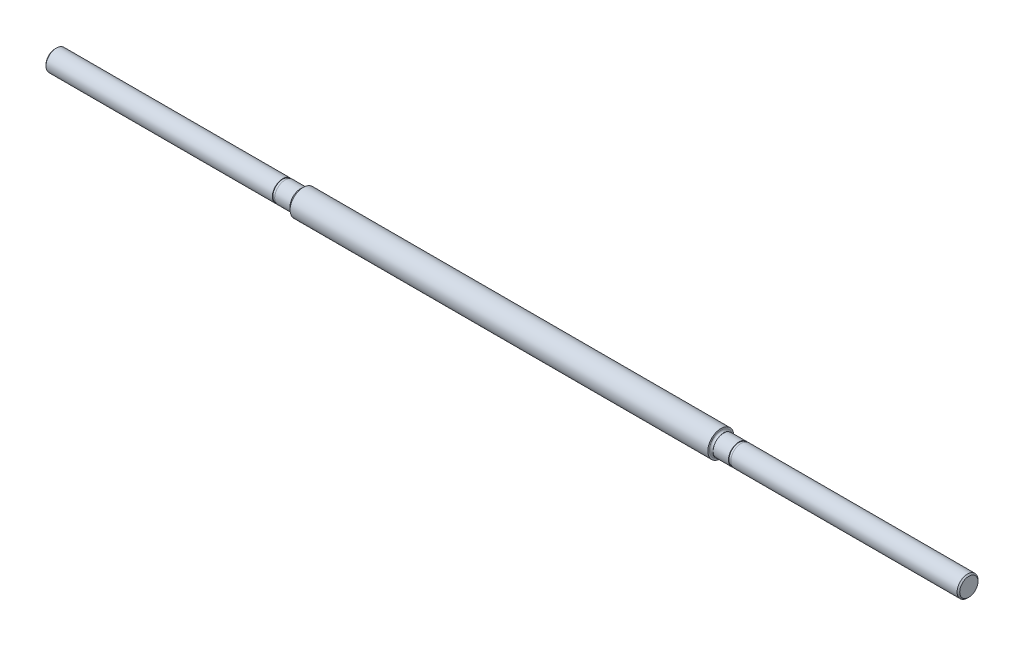
ISO-10303-21;
HEADER;
FILE_DESCRIPTION(('STEP AP214'),'2;1');
FILE_NAME('part.step','',(''),(''),'','','');
FILE_SCHEMA(('AUTOMOTIVE_DESIGN { 1 0 10303 214 1 1 1 1 }'));
ENDSEC;
DATA;
#1=APPLICATION_CONTEXT('core data for automotive mechanical design processes');
#2=APPLICATION_PROTOCOL_DEFINITION('international standard','automotive_design',2000,#1);
#3=PRODUCT_CONTEXT('',#1,'mechanical');
#4=PRODUCT('Part','Part','',(#3));
#5=PRODUCT_RELATED_PRODUCT_CATEGORY('part','',(#4));
#6=PRODUCT_DEFINITION_FORMATION('','',#4);
#7=PRODUCT_DEFINITION_CONTEXT('part definition',#1,'design');
#8=PRODUCT_DEFINITION('design','',#6,#7);
#9=PRODUCT_DEFINITION_SHAPE('','',#8);
#10=(LENGTH_UNIT() NAMED_UNIT(*) SI_UNIT(.MILLI.,.METRE.));
#11=(NAMED_UNIT(*) PLANE_ANGLE_UNIT() SI_UNIT($,.RADIAN.));
#12=(NAMED_UNIT(*) SI_UNIT($,.STERADIAN.) SOLID_ANGLE_UNIT());
#13=UNCERTAINTY_MEASURE_WITH_UNIT(LENGTH_MEASURE(1.E-05),#10,'distance_accuracy_value','');
#14=(GEOMETRIC_REPRESENTATION_CONTEXT(3) GLOBAL_UNCERTAINTY_ASSIGNED_CONTEXT((#13)) GLOBAL_UNIT_ASSIGNED_CONTEXT((#10,
#11,#12)) REPRESENTATION_CONTEXT('',''));
#15=CARTESIAN_POINT('',(0.,0.,0.));
#16=DIRECTION('',(0.,0.,1.));
#17=DIRECTION('',(1.,0.,0.));
#18=AXIS2_PLACEMENT_3D('',#15,#16,#17);
#19=CARTESIAN_POINT('',(95.,4.,0.));
#20=DIRECTION('',(-1.,0.,0.));
#21=DIRECTION('',(0.,0.,1.));
#22=AXIS2_PLACEMENT_3D('',#19,#20,#21);
#23=PLANE('',#22);
#24=CARTESIAN_POINT('',(95.,0.,0.));
#25=DIRECTION('',(1.,0.,0.));
#26=DIRECTION('',(0.,-1.,0.));
#27=AXIS2_PLACEMENT_3D('',#24,#25,#26);
#28=CIRCLE('',#27,4.4);
#29=CARTESIAN_POINT('',(95.,0.,-4.4));
#30=VERTEX_POINT('',#29);
#31=EDGE_CURVE('E110',#30,#30,#28,.T.);
#32=ORIENTED_EDGE('',*,*,#31,.T.);
#33=EDGE_LOOP('',(#32));
#34=FACE_BOUND('',#33,.T.);
#35=CARTESIAN_POINT('',(95.,0.,0.));
#36=DIRECTION('',(-1.,0.,0.));
#37=DIRECTION('',(0.,0.,1.));
#38=AXIS2_PLACEMENT_3D('',#35,#36,#37);
#39=CIRCLE('',#38,5.);
#40=CARTESIAN_POINT('',(95.,-5.,0.));
#41=VERTEX_POINT('',#40);
#42=EDGE_CURVE('E28',#41,#41,#39,.T.);
#43=ORIENTED_EDGE('',*,*,#42,.T.);
#44=EDGE_LOOP('',(#43));
#45=FACE_BOUND('',#44,.T.);
#46=ADVANCED_FACE('F17',(#34,#45),#23,.T.);
#47=CARTESIAN_POINT('',(175.,0.,0.));
#48=DIRECTION('',(-1.,0.,0.));
#49=DIRECTION('',(0.,1.,0.));
#50=AXIS2_PLACEMENT_3D('',#47,#48,#49);
#51=CYLINDRICAL_SURFACE('',#50,5.);
#52=ORIENTED_EDGE('',*,*,#42,.F.);
#53=DIRECTION('',(1.,0.,0.));
#54=VECTOR('',#53,1.);
#55=CARTESIAN_POINT('',(175.,-5.,0.));
#56=LINE('',#55,#54);
#57=CARTESIAN_POINT('',(255.,-5.,0.));
#58=VERTEX_POINT('',#57);
#59=EDGE_CURVE('E11',#41,#58,#56,.T.);
#60=ORIENTED_EDGE('',*,*,#59,.T.);
#61=CARTESIAN_POINT('',(255.,0.,0.));
#62=DIRECTION('',(-1.,0.,0.));
#63=DIRECTION('',(0.,0.,1.));
#64=AXIS2_PLACEMENT_3D('',#61,#62,#63);
#65=CIRCLE('',#64,5.);
#66=EDGE_CURVE('E139',#58,#58,#65,.T.);
#67=ORIENTED_EDGE('',*,*,#66,.T.);
#68=ORIENTED_EDGE('',*,*,#59,.F.);
#69=EDGE_LOOP('',(#52,#60,#67,#68));
#70=FACE_BOUND('',#69,.T.);
#71=ADVANCED_FACE('F286',(#70),#51,.T.);
#72=CARTESIAN_POINT('',(255.,5.,0.));
#73=DIRECTION('',(1.,0.,0.));
#74=DIRECTION('',(0.,1.,0.));
#75=AXIS2_PLACEMENT_3D('',#72,#73,#74);
#76=PLANE('',#75);
#77=CARTESIAN_POINT('',(255.,0.,0.));
#78=DIRECTION('',(-1.,0.,0.));
#79=DIRECTION('',(0.,1.,0.));
#80=AXIS2_PLACEMENT_3D('',#77,#78,#79);
#81=CIRCLE('',#80,4.4);
#82=CARTESIAN_POINT('',(255.,0.,-4.4));
#83=VERTEX_POINT('',#82);
#84=EDGE_CURVE('E195',#83,#83,#81,.T.);
#85=ORIENTED_EDGE('',*,*,#84,.T.);
#86=EDGE_LOOP('',(#85));
#87=FACE_BOUND('',#86,.T.);
#88=ORIENTED_EDGE('',*,*,#66,.F.);
#89=EDGE_LOOP('',(#88));
#90=FACE_BOUND('',#89,.T.);
#91=ADVANCED_FACE('F282',(#87,#90),#76,.T.);
#92=CARTESIAN_POINT('',(0.,0.,0.));
#93=DIRECTION('',(-1.,0.,0.));
#94=DIRECTION('',(0.,0.,1.));
#95=AXIS2_PLACEMENT_3D('',#92,#93,#94);
#96=PLANE('',#95);
#97=CARTESIAN_POINT('',(0.,0.,0.));
#98=DIRECTION('',(1.,0.,0.));
#99=DIRECTION('',(0.,-1.,0.));
#100=AXIS2_PLACEMENT_3D('',#97,#98,#99);
#101=CIRCLE('',#100,3.5);
#102=CARTESIAN_POINT('',(0.,3.5,0.));
#103=VERTEX_POINT('',#102);
#104=EDGE_CURVE('E225',#103,#103,#101,.T.);
#105=ORIENTED_EDGE('',*,*,#104,.F.);
#106=EDGE_LOOP('',(#105));
#107=FACE_BOUND('',#106,.T.);
#108=ADVANCED_FACE('F285',(#107),#96,.T.);
#109=CARTESIAN_POINT('',(22.5,0.,0.));
#110=DIRECTION('',(-1.,0.,0.));
#111=DIRECTION('',(0.,1.,0.));
#112=AXIS2_PLACEMENT_3D('',#109,#110,#111);
#113=CYLINDRICAL_SURFACE('',#112,4.);
#114=CARTESIAN_POINT('',(88.1,0.,0.));
#115=DIRECTION('',(1.,0.,0.));
#116=DIRECTION('',(0.,1.,0.));
#117=AXIS2_PLACEMENT_3D('',#114,#115,#116);
#118=CIRCLE('',#117,4.);
#119=CARTESIAN_POINT('',(88.1,-4.,0.));
#120=VERTEX_POINT('',#119);
#121=EDGE_CURVE('E137',#120,#120,#118,.T.);
#122=ORIENTED_EDGE('',*,*,#121,.T.);
#123=DIRECTION('',(1.,0.,0.));
#124=VECTOR('',#123,1.);
#125=CARTESIAN_POINT('',(22.5,-4.,0.));
#126=LINE('',#125,#124);
#127=CARTESIAN_POINT('',(93.9527864045,-4.,0.));
#128=VERTEX_POINT('',#127);
#129=EDGE_CURVE('E131',#120,#128,#126,.T.);
#130=ORIENTED_EDGE('',*,*,#129,.T.);
#131=CARTESIAN_POINT('',(93.9527864045,0.,0.));
#132=DIRECTION('',(-1.,0.,0.));
#133=DIRECTION('',(0.,1.,0.));
#134=AXIS2_PLACEMENT_3D('',#131,#132,#133);
#135=CIRCLE('',#134,4.);
#136=CARTESIAN_POINT('',(93.9527864045,0.,-4.));
#137=VERTEX_POINT('',#136);
#138=EDGE_CURVE('E135',#128,#137,#135,.T.);
#139=ORIENTED_EDGE('',*,*,#138,.T.);
#140=CARTESIAN_POINT('',(93.9527864045,0.,0.));
#141=DIRECTION('',(-1.,0.,0.));
#142=DIRECTION('',(0.,1.,0.));
#143=AXIS2_PLACEMENT_3D('',#140,#141,#142);
#144=CIRCLE('',#143,4.);
#145=EDGE_CURVE('E141',#137,#128,#144,.T.);
#146=ORIENTED_EDGE('',*,*,#145,.T.);
#147=ORIENTED_EDGE('',*,*,#129,.F.);
#148=EDGE_LOOP('',(#122,#130,#139,#146,#147));
#149=FACE_BOUND('',#148,.T.);
#150=ADVANCED_FACE('F133',(#149),#113,.T.);
#151=CARTESIAN_POINT('',(0.25,0.,0.));
#152=DIRECTION('',(1.,0.,0.));
#153=DIRECTION('',(0.,-1.,0.));
#154=AXIS2_PLACEMENT_3D('',#151,#152,#153);
#155=CONICAL_SURFACE('',#154,3.75,0.78539816339745);
#156=ORIENTED_EDGE('',*,*,#104,.T.);
#157=DIRECTION('',(0.707106781186546,0.707106781186549,0.));
#158=VECTOR('',#157,1.);
#159=CARTESIAN_POINT('',(0.25,3.75,0.));
#160=LINE('',#159,#158);
#161=CARTESIAN_POINT('',(0.5,4.,0.));
#162=VERTEX_POINT('',#161);
#163=EDGE_CURVE('E103',#103,#162,#160,.T.);
#164=ORIENTED_EDGE('',*,*,#163,.T.);
#165=CARTESIAN_POINT('',(0.5,0.,0.));
#166=DIRECTION('',(-1.,0.,0.));
#167=DIRECTION('',(0.,-1.,0.));
#168=AXIS2_PLACEMENT_3D('',#165,#166,#167);
#169=CIRCLE('',#168,4.);
#170=CARTESIAN_POINT('',(0.5,-4.,0.));
#171=VERTEX_POINT('',#170);
#172=EDGE_CURVE('E161',#162,#171,#169,.T.);
#173=ORIENTED_EDGE('',*,*,#172,.T.);
#174=CARTESIAN_POINT('',(0.5,0.,0.));
#175=DIRECTION('',(-1.,0.,0.));
#176=DIRECTION('',(0.,-1.,0.));
#177=AXIS2_PLACEMENT_3D('',#174,#175,#176);
#178=CIRCLE('',#177,4.);
#179=EDGE_CURVE('E155',#171,#162,#178,.T.);
#180=ORIENTED_EDGE('',*,*,#179,.T.);
#181=ORIENTED_EDGE('',*,*,#163,.F.);
#182=EDGE_LOOP('',(#156,#164,#173,#180,#181));
#183=FACE_BOUND('',#182,.T.);
#184=ADVANCED_FACE('F329',(#183),#155,.T.);
#185=CARTESIAN_POINT('',(94.4,0.,0.));
#186=DIRECTION('',(-1.,0.,0.));
#187=DIRECTION('',(0.,0.,1.));
#188=AXIS2_PLACEMENT_3D('',#185,#186,#187);
#189=TOROIDAL_SURFACE('',#188,4.4,0.6);
#190=ORIENTED_EDGE('',*,*,#138,.F.);
#191=ORIENTED_EDGE('',*,*,#145,.F.);
#192=CARTESIAN_POINT('',(94.4,0.,-4.4));
#193=DIRECTION('',(0.,1.,0.));
#194=DIRECTION('',(0.,0.,-1.));
#195=AXIS2_PLACEMENT_3D('',#192,#193,#194);
#196=CIRCLE('',#195,0.6);
#197=EDGE_CURVE('E145',#137,#30,#196,.T.);
#198=ORIENTED_EDGE('',*,*,#197,.T.);
#199=ORIENTED_EDGE('',*,*,#31,.F.);
#200=ORIENTED_EDGE('',*,*,#197,.F.);
#201=EDGE_LOOP('',(#190,#191,#198,#199,#200));
#202=FACE_BOUND('',#201,.T.);
#203=ADVANCED_FACE('F147',(#202),#189,.F.);
#204=CARTESIAN_POINT('',(22.5,0.,0.));
#205=DIRECTION('',(-1.,0.,0.));
#206=DIRECTION('',(0.,1.,0.));
#207=AXIS2_PLACEMENT_3D('',#204,#205,#206);
#208=CYLINDRICAL_SURFACE('',#207,4.);
#209=ORIENTED_EDGE('',*,*,#172,.F.);
#210=ORIENTED_EDGE('',*,*,#179,.F.);
#211=DIRECTION('',(1.,0.,0.));
#212=VECTOR('',#211,1.);
#213=CARTESIAN_POINT('',(22.5,-4.,0.));
#214=LINE('',#213,#212);
#215=CARTESIAN_POINT('',(87.2,-4.,0.));
#216=VERTEX_POINT('',#215);
#217=EDGE_CURVE('E149',#171,#216,#214,.T.);
#218=ORIENTED_EDGE('',*,*,#217,.T.);
#219=CARTESIAN_POINT('',(87.2,0.,0.));
#220=DIRECTION('',(-1.,0.,0.));
#221=DIRECTION('',(0.,1.,0.));
#222=AXIS2_PLACEMENT_3D('',#219,#220,#221);
#223=CIRCLE('',#222,4.);
#224=EDGE_CURVE('E164',#216,#216,#223,.T.);
#225=ORIENTED_EDGE('',*,*,#224,.T.);
#226=ORIENTED_EDGE('',*,*,#217,.F.);
#227=EDGE_LOOP('',(#209,#210,#218,#225,#226));
#228=FACE_BOUND('',#227,.T.);
#229=ADVANCED_FACE('F312',(#228),#208,.T.);
#230=CARTESIAN_POINT('',(87.2,0.,0.));
#231=DIRECTION('',(-1.,0.,0.));
#232=DIRECTION('',(0.,0.,1.));
#233=AXIS2_PLACEMENT_3D('',#230,#231,#232);
#234=PLANE('',#233);
#235=CARTESIAN_POINT('',(87.2,0.,0.));
#236=DIRECTION('',(1.,0.,0.));
#237=DIRECTION('',(0.,-1.,0.));
#238=AXIS2_PLACEMENT_3D('',#235,#236,#237);
#239=CIRCLE('',#238,3.8);
#240=CARTESIAN_POINT('',(87.2,3.8,0.));
#241=VERTEX_POINT('',#240);
#242=EDGE_CURVE('E181',#241,#241,#239,.T.);
#243=ORIENTED_EDGE('',*,*,#242,.F.);
#244=EDGE_LOOP('',(#243));
#245=FACE_BOUND('',#244,.T.);
#246=ORIENTED_EDGE('',*,*,#224,.F.);
#247=EDGE_LOOP('',(#246));
#248=FACE_BOUND('',#247,.T.);
#249=ADVANCED_FACE('F309',(#245,#248),#234,.F.);
#250=CARTESIAN_POINT('',(88.1,0.,0.));
#251=DIRECTION('',(-1.,0.,0.));
#252=DIRECTION('',(0.,0.,1.));
#253=AXIS2_PLACEMENT_3D('',#250,#251,#252);
#254=PLANE('',#253);
#255=CARTESIAN_POINT('',(88.1,0.,0.));
#256=DIRECTION('',(-1.,0.,0.));
#257=DIRECTION('',(0.,-1.,0.));
#258=AXIS2_PLACEMENT_3D('',#255,#256,#257);
#259=CIRCLE('',#258,3.8);
#260=CARTESIAN_POINT('',(88.1,3.8,0.));
#261=VERTEX_POINT('',#260);
#262=EDGE_CURVE('E180',#261,#261,#259,.T.);
#263=ORIENTED_EDGE('',*,*,#262,.F.);
#264=EDGE_LOOP('',(#263));
#265=FACE_BOUND('',#264,.T.);
#266=ORIENTED_EDGE('',*,*,#121,.F.);
#267=EDGE_LOOP('',(#266));
#268=FACE_BOUND('',#267,.T.);
#269=ADVANCED_FACE('F311',(#265,#268),#254,.T.);
#270=CARTESIAN_POINT('',(87.65,0.,0.));
#271=DIRECTION('',(-1.,0.,0.));
#272=DIRECTION('',(0.,-1.,0.));
#273=AXIS2_PLACEMENT_3D('',#270,#271,#272);
#274=CYLINDRICAL_SURFACE('',#273,3.8);
#275=ORIENTED_EDGE('',*,*,#242,.T.);
#276=DIRECTION('',(1.,0.,0.));
#277=VECTOR('',#276,1.);
#278=CARTESIAN_POINT('',(87.65,3.8,0.));
#279=LINE('',#278,#277);
#280=EDGE_CURVE('E177',#241,#261,#279,.T.);
#281=ORIENTED_EDGE('',*,*,#280,.T.);
#282=ORIENTED_EDGE('',*,*,#262,.T.);
#283=ORIENTED_EDGE('',*,*,#280,.F.);
#284=EDGE_LOOP('',(#275,#281,#282,#283));
#285=FACE_BOUND('',#284,.T.);
#286=ADVANCED_FACE('F319',(#285),#274,.T.);
#287=CARTESIAN_POINT('',(255.6,0.,0.));
#288=DIRECTION('',(-1.,0.,0.));
#289=DIRECTION('',(0.,0.,1.));
#290=AXIS2_PLACEMENT_3D('',#287,#288,#289);
#291=TOROIDAL_SURFACE('',#290,4.4,0.6);
#292=ORIENTED_EDGE('',*,*,#84,.F.);
#293=CARTESIAN_POINT('',(255.6,0.,-4.4));
#294=DIRECTION('',(0.,1.,0.));
#295=DIRECTION('',(0.,0.,-1.));
#296=AXIS2_PLACEMENT_3D('',#293,#294,#295);
#297=CIRCLE('',#296,0.6);
#298=CARTESIAN_POINT('',(256.0472135955,0.,-4.));
#299=VERTEX_POINT('',#298);
#300=EDGE_CURVE('E189',#83,#299,#297,.T.);
#301=ORIENTED_EDGE('',*,*,#300,.T.);
#302=CARTESIAN_POINT('',(256.0472135955,0.,0.));
#303=DIRECTION('',(1.,0.,0.));
#304=DIRECTION('',(0.,1.,0.));
#305=AXIS2_PLACEMENT_3D('',#302,#303,#304);
#306=CIRCLE('',#305,4.);
#307=CARTESIAN_POINT('',(256.0472135955,-4.,0.));
#308=VERTEX_POINT('',#307);
#309=EDGE_CURVE('E206',#308,#299,#306,.T.);
#310=ORIENTED_EDGE('',*,*,#309,.F.);
#311=CARTESIAN_POINT('',(256.0472135955,0.,0.));
#312=DIRECTION('',(1.,0.,0.));
#313=DIRECTION('',(0.,1.,0.));
#314=AXIS2_PLACEMENT_3D('',#311,#312,#313);
#315=CIRCLE('',#314,4.);
#316=EDGE_CURVE('E175',#299,#308,#315,.T.);
#317=ORIENTED_EDGE('',*,*,#316,.F.);
#318=ORIENTED_EDGE('',*,*,#300,.F.);
#319=EDGE_LOOP('',(#292,#301,#310,#317,#318));
#320=FACE_BOUND('',#319,.T.);
#321=ADVANCED_FACE('F280',(#320),#291,.F.);
#322=CARTESIAN_POINT('',(280.,0.,0.));
#323=DIRECTION('',(-1.,0.,0.));
#324=DIRECTION('',(0.,1.,0.));
#325=AXIS2_PLACEMENT_3D('',#322,#323,#324);
#326=CYLINDRICAL_SURFACE('',#325,4.);
#327=ORIENTED_EDGE('',*,*,#316,.T.);
#328=DIRECTION('',(1.,0.,0.));
#329=VECTOR('',#328,1.);
#330=CARTESIAN_POINT('',(280.,-4.,0.));
#331=LINE('',#330,#329);
#332=CARTESIAN_POINT('',(261.9,-4.,0.));
#333=VERTEX_POINT('',#332);
#334=EDGE_CURVE('E233',#308,#333,#331,.T.);
#335=ORIENTED_EDGE('',*,*,#334,.T.);
#336=CARTESIAN_POINT('',(261.9,0.,0.));
#337=DIRECTION('',(-1.,0.,0.));
#338=DIRECTION('',(0.,1.,0.));
#339=AXIS2_PLACEMENT_3D('',#336,#337,#338);
#340=CIRCLE('',#339,4.);
#341=EDGE_CURVE('E171',#333,#333,#340,.T.);
#342=ORIENTED_EDGE('',*,*,#341,.T.);
#343=ORIENTED_EDGE('',*,*,#334,.F.);
#344=ORIENTED_EDGE('',*,*,#309,.T.);
#345=EDGE_LOOP('',(#327,#335,#342,#343,#344));
#346=FACE_BOUND('',#345,.T.);
#347=ADVANCED_FACE('F270',(#346),#326,.T.);
#348=CARTESIAN_POINT('',(261.9,0.,0.));
#349=DIRECTION('',(-1.,0.,0.));
#350=DIRECTION('',(0.,0.,1.));
#351=AXIS2_PLACEMENT_3D('',#348,#349,#350);
#352=PLANE('',#351);
#353=CARTESIAN_POINT('',(261.9,0.,0.));
#354=DIRECTION('',(1.,0.,0.));
#355=DIRECTION('',(0.,-1.,0.));
#356=AXIS2_PLACEMENT_3D('',#353,#354,#355);
#357=CIRCLE('',#356,3.8);
#358=CARTESIAN_POINT('',(261.9,3.8,0.));
#359=VERTEX_POINT('',#358);
#360=EDGE_CURVE('E239',#359,#359,#357,.T.);
#361=ORIENTED_EDGE('',*,*,#360,.F.);
#362=EDGE_LOOP('',(#361));
#363=FACE_BOUND('',#362,.T.);
#364=ORIENTED_EDGE('',*,*,#341,.F.);
#365=EDGE_LOOP('',(#364));
#366=FACE_BOUND('',#365,.T.);
#367=ADVANCED_FACE('F266',(#363,#366),#352,.F.);
#368=CARTESIAN_POINT('',(262.8,0.,0.));
#369=DIRECTION('',(-1.,0.,0.));
#370=DIRECTION('',(0.,0.,1.));
#371=AXIS2_PLACEMENT_3D('',#368,#369,#370);
#372=PLANE('',#371);
#373=CARTESIAN_POINT('',(262.8,0.,0.));
#374=DIRECTION('',(-1.,0.,0.));
#375=DIRECTION('',(0.,-1.,0.));
#376=AXIS2_PLACEMENT_3D('',#373,#374,#375);
#377=CIRCLE('',#376,3.8);
#378=CARTESIAN_POINT('',(262.8,3.8,0.));
#379=VERTEX_POINT('',#378);
#380=EDGE_CURVE('E176',#379,#379,#377,.T.);
#381=ORIENTED_EDGE('',*,*,#380,.F.);
#382=EDGE_LOOP('',(#381));
#383=FACE_BOUND('',#382,.T.);
#384=CARTESIAN_POINT('',(262.8,0.,0.));
#385=DIRECTION('',(1.,0.,0.));
#386=DIRECTION('',(0.,1.,0.));
#387=AXIS2_PLACEMENT_3D('',#384,#385,#386);
#388=CIRCLE('',#387,4.);
#389=CARTESIAN_POINT('',(262.8,-4.,0.));
#390=VERTEX_POINT('',#389);
#391=EDGE_CURVE('E207',#390,#390,#388,.T.);
#392=ORIENTED_EDGE('',*,*,#391,.F.);
#393=EDGE_LOOP('',(#392));
#394=FACE_BOUND('',#393,.T.);
#395=ADVANCED_FACE('F269',(#383,#394),#372,.T.);
#396=CARTESIAN_POINT('',(262.35,0.,0.));
#397=DIRECTION('',(-1.,0.,0.));
#398=DIRECTION('',(0.,-1.,0.));
#399=AXIS2_PLACEMENT_3D('',#396,#397,#398);
#400=CYLINDRICAL_SURFACE('',#399,3.8);
#401=ORIENTED_EDGE('',*,*,#360,.T.);
#402=DIRECTION('',(1.,0.,0.));
#403=VECTOR('',#402,1.);
#404=CARTESIAN_POINT('',(262.35,3.8,0.));
#405=LINE('',#404,#403);
#406=EDGE_CURVE('E21',#359,#379,#405,.T.);
#407=ORIENTED_EDGE('',*,*,#406,.T.);
#408=ORIENTED_EDGE('',*,*,#380,.T.);
#409=ORIENTED_EDGE('',*,*,#406,.F.);
#410=EDGE_LOOP('',(#401,#407,#408,#409));
#411=FACE_BOUND('',#410,.T.);
#412=ADVANCED_FACE('F263',(#411),#400,.T.);
#413=CARTESIAN_POINT('',(350.,4.,0.));
#414=DIRECTION('',(1.,0.,0.));
#415=DIRECTION('',(0.,1.,0.));
#416=AXIS2_PLACEMENT_3D('',#413,#414,#415);
#417=PLANE('',#416);
#418=CARTESIAN_POINT('',(350.,0.,0.));
#419=DIRECTION('',(-1.,0.,0.));
#420=DIRECTION('',(0.,-1.,0.));
#421=AXIS2_PLACEMENT_3D('',#418,#419,#420);
#422=CIRCLE('',#421,3.5);
#423=CARTESIAN_POINT('',(350.,3.5,0.));
#424=VERTEX_POINT('',#423);
#425=EDGE_CURVE('E159',#424,#424,#422,.T.);
#426=ORIENTED_EDGE('',*,*,#425,.F.);
#427=EDGE_LOOP('',(#426));
#428=FACE_BOUND('',#427,.T.);
#429=ADVANCED_FACE('F19',(#428),#417,.T.);
#430=CARTESIAN_POINT('',(280.,0.,0.));
#431=DIRECTION('',(-1.,0.,0.));
#432=DIRECTION('',(0.,1.,0.));
#433=AXIS2_PLACEMENT_3D('',#430,#431,#432);
#434=CYLINDRICAL_SURFACE('',#433,4.);
#435=ORIENTED_EDGE('',*,*,#391,.T.);
#436=DIRECTION('',(1.,0.,0.));
#437=VECTOR('',#436,1.);
#438=CARTESIAN_POINT('',(280.,-4.,0.));
#439=LINE('',#438,#437);
#440=CARTESIAN_POINT('',(349.5,-4.,0.));
#441=VERTEX_POINT('',#440);
#442=EDGE_CURVE('E199',#390,#441,#439,.T.);
#443=ORIENTED_EDGE('',*,*,#442,.T.);
#444=CARTESIAN_POINT('',(349.5,0.,0.));
#445=DIRECTION('',(1.,0.,0.));
#446=DIRECTION('',(0.,-1.,0.));
#447=AXIS2_PLACEMENT_3D('',#444,#445,#446);
#448=CIRCLE('',#447,4.);
#449=CARTESIAN_POINT('',(349.5,4.,0.));
#450=VERTEX_POINT('',#449);
#451=EDGE_CURVE('E210',#450,#441,#448,.T.);
#452=ORIENTED_EDGE('',*,*,#451,.F.);
#453=CARTESIAN_POINT('',(349.5,0.,0.));
#454=DIRECTION('',(1.,0.,0.));
#455=DIRECTION('',(0.,-1.,0.));
#456=AXIS2_PLACEMENT_3D('',#453,#454,#455);
#457=CIRCLE('',#456,4.);
#458=EDGE_CURVE('E170',#441,#450,#457,.T.);
#459=ORIENTED_EDGE('',*,*,#458,.F.);
#460=ORIENTED_EDGE('',*,*,#442,.F.);
#461=EDGE_LOOP('',(#435,#443,#452,#459,#460));
#462=FACE_BOUND('',#461,.T.);
#463=ADVANCED_FACE('F304',(#462),#434,.T.);
#464=CARTESIAN_POINT('',(349.75,0.,0.));
#465=DIRECTION('',(-1.,0.,0.));
#466=DIRECTION('',(0.,-1.,0.));
#467=AXIS2_PLACEMENT_3D('',#464,#465,#466);
#468=CONICAL_SURFACE('',#467,3.75,0.785398163397476);
#469=ORIENTED_EDGE('',*,*,#451,.T.);
#470=ORIENTED_EDGE('',*,*,#458,.T.);
#471=DIRECTION('',(0.707106781186527,-0.707106781186568,0.));
#472=VECTOR('',#471,1.);
#473=CARTESIAN_POINT('',(349.75,3.75,0.));
#474=LINE('',#473,#472);
#475=EDGE_CURVE('E166',#450,#424,#474,.T.);
#476=ORIENTED_EDGE('',*,*,#475,.T.);
#477=ORIENTED_EDGE('',*,*,#425,.T.);
#478=ORIENTED_EDGE('',*,*,#475,.F.);
#479=EDGE_LOOP('',(#469,#470,#476,#477,#478));
#480=FACE_BOUND('',#479,.T.);
#481=ADVANCED_FACE('F307',(#480),#468,.T.);
#482=CLOSED_SHELL('',(#46,#71,#91,#108,#150,#184,#203,#229,#249,#269,#286,#321,#347,#367,#395,
#412,#429,#463,#481));
#483=MANIFOLD_SOLID_BREP('B1',#482);
#484=ADVANCED_BREP_SHAPE_REPRESENTATION('',(#18,#483),#14);
#485=SHAPE_DEFINITION_REPRESENTATION(#9,#484);
ENDSEC;
END-ISO-10303-21;
